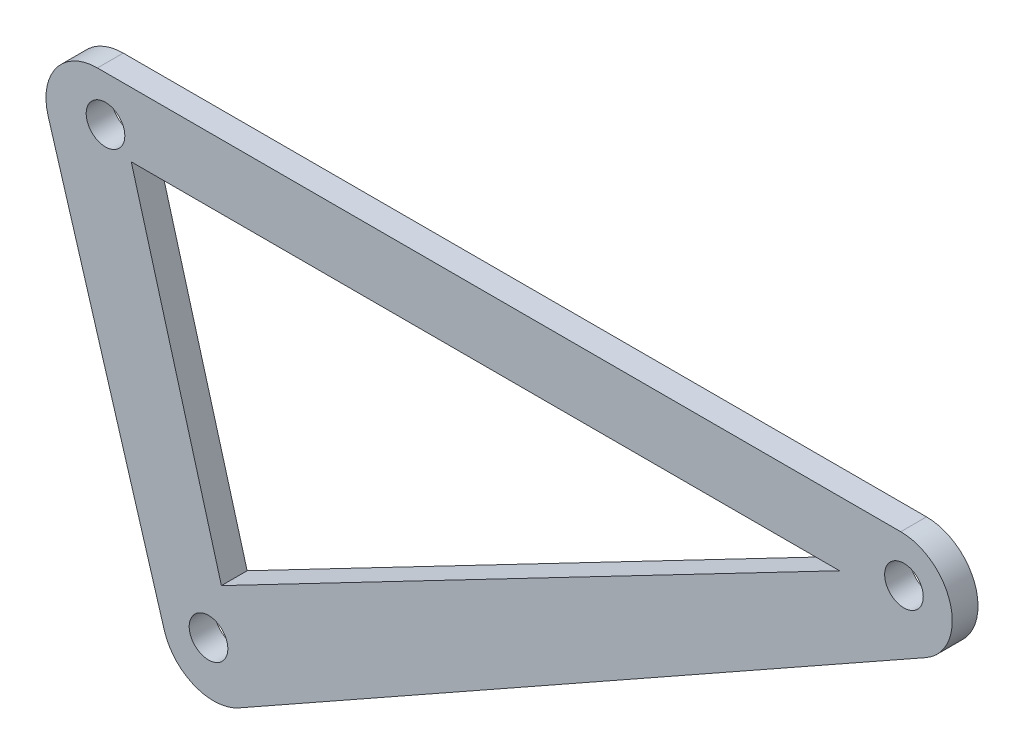
ISO-10303-21;
HEADER;
FILE_DESCRIPTION(('STEP AP214'),'2;1');
FILE_NAME('part.step','',(''),(''),'','','');
FILE_SCHEMA(('AUTOMOTIVE_DESIGN { 1 0 10303 214 1 1 1 1 }'));
ENDSEC;
DATA;
#1=APPLICATION_CONTEXT('core data for automotive mechanical design processes');
#2=APPLICATION_PROTOCOL_DEFINITION('international standard','automotive_design',2000,#1);
#3=PRODUCT_CONTEXT('',#1,'mechanical');
#4=PRODUCT('Part','Part','',(#3));
#5=PRODUCT_RELATED_PRODUCT_CATEGORY('part','',(#4));
#6=PRODUCT_DEFINITION_FORMATION('','',#4);
#7=PRODUCT_DEFINITION_CONTEXT('part definition',#1,'design');
#8=PRODUCT_DEFINITION('design','',#6,#7);
#9=PRODUCT_DEFINITION_SHAPE('','',#8);
#10=(LENGTH_UNIT() NAMED_UNIT(*) SI_UNIT(.MILLI.,.METRE.));
#11=(NAMED_UNIT(*) PLANE_ANGLE_UNIT() SI_UNIT($,.RADIAN.));
#12=(NAMED_UNIT(*) SI_UNIT($,.STERADIAN.) SOLID_ANGLE_UNIT());
#13=UNCERTAINTY_MEASURE_WITH_UNIT(LENGTH_MEASURE(1.E-05),#10,'distance_accuracy_value','');
#14=(GEOMETRIC_REPRESENTATION_CONTEXT(3) GLOBAL_UNCERTAINTY_ASSIGNED_CONTEXT((#13)) GLOBAL_UNIT_ASSIGNED_CONTEXT((#10,
#11,#12)) REPRESENTATION_CONTEXT('',''));
#15=CARTESIAN_POINT('',(0.,0.,0.));
#16=DIRECTION('',(0.,0.,1.));
#17=DIRECTION('',(1.,0.,0.));
#18=AXIS2_PLACEMENT_3D('',#15,#16,#17);
#19=CARTESIAN_POINT('',(-22.,11.5,0.));
#20=DIRECTION('',(0.,0.,-1.));
#21=DIRECTION('',(1.,0.,0.));
#22=AXIS2_PLACEMENT_3D('',#19,#20,#21);
#23=CYLINDRICAL_SURFACE('',#22,1.5);
#24=DIRECTION('',(0.,0.,1.));
#25=VECTOR('',#24,1.);
#26=CARTESIAN_POINT('',(-20.5,11.5,0.));
#27=LINE('',#26,#25);
#28=CARTESIAN_POINT('',(-20.5,11.5,0.));
#29=VERTEX_POINT('',#28);
#30=CARTESIAN_POINT('',(-20.5,11.5,2.));
#31=VERTEX_POINT('',#30);
#32=EDGE_CURVE('E9',#29,#31,#27,.T.);
#33=ORIENTED_EDGE('',*,*,#32,.T.);
#34=CARTESIAN_POINT('',(-22.,11.5,2.));
#35=DIRECTION('',(0.,0.,1.));
#36=DIRECTION('',(1.,0.,0.));
#37=AXIS2_PLACEMENT_3D('',#34,#35,#36);
#38=CIRCLE('',#37,1.5);
#39=EDGE_CURVE('E146',#31,#31,#38,.T.);
#40=ORIENTED_EDGE('',*,*,#39,.T.);
#41=ORIENTED_EDGE('',*,*,#32,.F.);
#42=CARTESIAN_POINT('',(-22.,11.5,0.));
#43=DIRECTION('',(0.,0.,1.));
#44=DIRECTION('',(1.,0.,0.));
#45=AXIS2_PLACEMENT_3D('',#42,#43,#44);
#46=CIRCLE('',#45,1.5);
#47=EDGE_CURVE('E185',#29,#29,#46,.T.);
#48=ORIENTED_EDGE('',*,*,#47,.F.);
#49=EDGE_LOOP('',(#33,#40,#41,#48));
#50=FACE_BOUND('',#49,.T.);
#51=ADVANCED_FACE('F14',(#50),#23,.F.);
#52=CARTESIAN_POINT('',(-14.,-19.,0.));
#53=DIRECTION('',(0.,0.,-1.));
#54=DIRECTION('',(1.,0.,0.));
#55=AXIS2_PLACEMENT_3D('',#52,#53,#54);
#56=CYLINDRICAL_SURFACE('',#55,1.5);
#57=DIRECTION('',(0.,0.,1.));
#58=VECTOR('',#57,1.);
#59=CARTESIAN_POINT('',(-12.5,-19.,0.));
#60=LINE('',#59,#58);
#61=CARTESIAN_POINT('',(-12.5,-19.,0.));
#62=VERTEX_POINT('',#61);
#63=CARTESIAN_POINT('',(-12.5,-19.,2.));
#64=VERTEX_POINT('',#63);
#65=EDGE_CURVE('E25',#62,#64,#60,.T.);
#66=ORIENTED_EDGE('',*,*,#65,.T.);
#67=CARTESIAN_POINT('',(-14.,-19.,2.));
#68=DIRECTION('',(0.,0.,1.));
#69=DIRECTION('',(1.,0.,0.));
#70=AXIS2_PLACEMENT_3D('',#67,#68,#69);
#71=CIRCLE('',#70,1.5);
#72=EDGE_CURVE('E201',#64,#64,#71,.T.);
#73=ORIENTED_EDGE('',*,*,#72,.T.);
#74=ORIENTED_EDGE('',*,*,#65,.F.);
#75=CARTESIAN_POINT('',(-14.,-19.,0.));
#76=DIRECTION('',(0.,0.,1.));
#77=DIRECTION('',(1.,0.,0.));
#78=AXIS2_PLACEMENT_3D('',#75,#76,#77);
#79=CIRCLE('',#78,1.5);
#80=EDGE_CURVE('E188',#62,#62,#79,.T.);
#81=ORIENTED_EDGE('',*,*,#80,.F.);
#82=EDGE_LOOP('',(#66,#73,#74,#81));
#83=FACE_BOUND('',#82,.T.);
#84=ADVANCED_FACE('F300',(#83),#56,.F.);
#85=CARTESIAN_POINT('',(40.,11.5,0.));
#86=DIRECTION('',(0.,0.,-1.));
#87=DIRECTION('',(1.,0.,0.));
#88=AXIS2_PLACEMENT_3D('',#85,#86,#87);
#89=CYLINDRICAL_SURFACE('',#88,1.5);
#90=DIRECTION('',(0.,0.,1.));
#91=VECTOR('',#90,1.);
#92=CARTESIAN_POINT('',(41.5,11.5,0.));
#93=LINE('',#92,#91);
#94=CARTESIAN_POINT('',(41.5,11.5,0.));
#95=VERTEX_POINT('',#94);
#96=CARTESIAN_POINT('',(41.5,11.5,2.));
#97=VERTEX_POINT('',#96);
#98=EDGE_CURVE('E197',#95,#97,#93,.T.);
#99=ORIENTED_EDGE('',*,*,#98,.T.);
#100=CARTESIAN_POINT('',(40.,11.5,2.));
#101=DIRECTION('',(0.,0.,1.));
#102=DIRECTION('',(1.,0.,0.));
#103=AXIS2_PLACEMENT_3D('',#100,#101,#102);
#104=CIRCLE('',#103,1.5);
#105=EDGE_CURVE('E208',#97,#97,#104,.T.);
#106=ORIENTED_EDGE('',*,*,#105,.T.);
#107=ORIENTED_EDGE('',*,*,#98,.F.);
#108=CARTESIAN_POINT('',(40.,11.5,0.));
#109=DIRECTION('',(0.,0.,1.));
#110=DIRECTION('',(1.,0.,0.));
#111=AXIS2_PLACEMENT_3D('',#108,#109,#110);
#112=CIRCLE('',#111,1.5);
#113=EDGE_CURVE('E177',#95,#95,#112,.T.);
#114=ORIENTED_EDGE('',*,*,#113,.F.);
#115=EDGE_LOOP('',(#99,#106,#107,#114));
#116=FACE_BOUND('',#115,.T.);
#117=ADVANCED_FACE('F304',(#116),#89,.F.);
#118=CARTESIAN_POINT('',(-20.,10.,0.));
#119=DIRECTION('',(0.962964019714161,0.269629925520045,0.));
#120=DIRECTION('',(0.,0.,-1.));
#121=AXIS2_PLACEMENT_3D('',#118,#119,#120);
#122=PLANE('',#121);
#123=DIRECTION('',(0.,0.,1.));
#124=VECTOR('',#123,1.);
#125=CARTESIAN_POINT('',(-20.,10.,0.));
#126=LINE('',#125,#124);
#127=CARTESIAN_POINT('',(-20.,10.,0.));
#128=VERTEX_POINT('',#127);
#129=CARTESIAN_POINT('',(-20.,10.,2.));
#130=VERTEX_POINT('',#129);
#131=EDGE_CURVE('E198',#128,#130,#126,.T.);
#132=ORIENTED_EDGE('',*,*,#131,.T.);
#133=DIRECTION('',(0.269629925520045,-0.962964019714161,0.));
#134=VECTOR('',#133,1.);
#135=CARTESIAN_POINT('',(-20.,10.,2.));
#136=LINE('',#135,#134);
#137=CARTESIAN_POINT('',(-13.,-15.,2.));
#138=VERTEX_POINT('',#137);
#139=EDGE_CURVE('E183',#130,#138,#136,.T.);
#140=ORIENTED_EDGE('',*,*,#139,.T.);
#141=DIRECTION('',(0.,0.,1.));
#142=VECTOR('',#141,1.);
#143=CARTESIAN_POINT('',(-13.,-15.,0.));
#144=LINE('',#143,#142);
#145=CARTESIAN_POINT('',(-13.,-15.,0.));
#146=VERTEX_POINT('',#145);
#147=EDGE_CURVE('E193',#146,#138,#144,.T.);
#148=ORIENTED_EDGE('',*,*,#147,.F.);
#149=DIRECTION('',(0.269629925520045,-0.962964019714161,0.));
#150=VECTOR('',#149,1.);
#151=CARTESIAN_POINT('',(-20.,10.,0.));
#152=LINE('',#151,#150);
#153=EDGE_CURVE('E234',#128,#146,#152,.T.);
#154=ORIENTED_EDGE('',*,*,#153,.F.);
#155=EDGE_LOOP('',(#132,#140,#148,#154));
#156=FACE_BOUND('',#155,.T.);
#157=ADVANCED_FACE('F16',(#156),#122,.T.);
#158=CARTESIAN_POINT('',(-13.,-15.,0.));
#159=DIRECTION('',(-0.461934418836985,0.886914084166971,0.));
#160=DIRECTION('',(0.,0.,1.));
#161=AXIS2_PLACEMENT_3D('',#158,#159,#160);
#162=PLANE('',#161);
#163=ORIENTED_EDGE('',*,*,#147,.T.);
#164=DIRECTION('',(0.886914084166971,0.461934418836985,0.));
#165=VECTOR('',#164,1.);
#166=CARTESIAN_POINT('',(-13.,-15.,2.));
#167=LINE('',#166,#165);
#168=CARTESIAN_POINT('',(35.,10.,2.));
#169=VERTEX_POINT('',#168);
#170=EDGE_CURVE('E179',#138,#169,#167,.T.);
#171=ORIENTED_EDGE('',*,*,#170,.T.);
#172=DIRECTION('',(0.,0.,1.));
#173=VECTOR('',#172,1.);
#174=CARTESIAN_POINT('',(35.,10.,0.));
#175=LINE('',#174,#173);
#176=CARTESIAN_POINT('',(35.,10.,0.));
#177=VERTEX_POINT('',#176);
#178=EDGE_CURVE('E212',#177,#169,#175,.T.);
#179=ORIENTED_EDGE('',*,*,#178,.F.);
#180=DIRECTION('',(0.886914084166971,0.461934418836985,0.));
#181=VECTOR('',#180,1.);
#182=CARTESIAN_POINT('',(-13.,-15.,0.));
#183=LINE('',#182,#181);
#184=EDGE_CURVE('E178',#146,#177,#183,.T.);
#185=ORIENTED_EDGE('',*,*,#184,.F.);
#186=EDGE_LOOP('',(#163,#171,#179,#185));
#187=FACE_BOUND('',#186,.T.);
#188=ADVANCED_FACE('F309',(#187),#162,.T.);
#189=CARTESIAN_POINT('',(-20.,10.,0.));
#190=DIRECTION('',(0.,1.,0.));
#191=DIRECTION('',(1.,0.,0.));
#192=AXIS2_PLACEMENT_3D('',#189,#190,#191);
#193=PLANE('',#192);
#194=DIRECTION('',(1.,0.,0.));
#195=VECTOR('',#194,1.);
#196=CARTESIAN_POINT('',(-20.,10.,0.));
#197=LINE('',#196,#195);
#198=EDGE_CURVE('E173',#128,#177,#197,.T.);
#199=ORIENTED_EDGE('',*,*,#198,.T.);
#200=ORIENTED_EDGE('',*,*,#178,.T.);
#201=DIRECTION('',(1.,0.,0.));
#202=VECTOR('',#201,1.);
#203=CARTESIAN_POINT('',(-20.,10.,2.));
#204=LINE('',#203,#202);
#205=EDGE_CURVE('E184',#130,#169,#204,.T.);
#206=ORIENTED_EDGE('',*,*,#205,.F.);
#207=ORIENTED_EDGE('',*,*,#131,.F.);
#208=EDGE_LOOP('',(#199,#200,#206,#207));
#209=FACE_BOUND('',#208,.T.);
#210=ADVANCED_FACE('F295',(#209),#193,.F.);
#211=CARTESIAN_POINT('',(-13.60585653325,-19.06006954394,0.));
#212=DIRECTION('',(0.,0.,1.));
#213=DIRECTION('',(-0.957826285221234,-0.28734788556607,0.));
#214=AXIS2_PLACEMENT_3D('',#211,#212,#213);
#215=CYLINDRICAL_SURFACE('',#214,4.);
#216=CARTESIAN_POINT('',(-13.60585653325,-19.06006954394,0.));
#217=DIRECTION('',(0.,0.,1.));
#218=DIRECTION('',(0.,-1.,0.));
#219=AXIS2_PLACEMENT_3D('',#216,#217,#218);
#220=CIRCLE('',#219,4.);
#221=CARTESIAN_POINT('',(-17.43716167413,-20.20946108621,0.));
#222=VERTEX_POINT('',#221);
#223=CARTESIAN_POINT('',(-11.64248159748,-22.54506005492,0.));
#224=VERTEX_POINT('',#223);
#225=EDGE_CURVE('E142',#222,#224,#220,.T.);
#226=ORIENTED_EDGE('',*,*,#225,.T.);
#227=DIRECTION('',(0.,0.,1.));
#228=VECTOR('',#227,1.);
#229=CARTESIAN_POINT('',(-11.64248159748,-22.54506005492,0.));
#230=LINE('',#229,#228);
#231=CARTESIAN_POINT('',(-11.64248159748,-22.54506005492,2.));
#232=VERTEX_POINT('',#231);
#233=EDGE_CURVE('E131',#224,#232,#230,.T.);
#234=ORIENTED_EDGE('',*,*,#233,.T.);
#235=CARTESIAN_POINT('',(-13.60585653325,-19.06006954394,2.));
#236=DIRECTION('',(0.,0.,1.));
#237=DIRECTION('',(0.,-1.,0.));
#238=AXIS2_PLACEMENT_3D('',#235,#236,#237);
#239=CIRCLE('',#238,4.);
#240=CARTESIAN_POINT('',(-17.43716167413,-20.20946108621,2.));
#241=VERTEX_POINT('',#240);
#242=EDGE_CURVE('E144',#241,#232,#239,.T.);
#243=ORIENTED_EDGE('',*,*,#242,.F.);
#244=DIRECTION('',(0.,0.,1.));
#245=VECTOR('',#244,1.);
#246=CARTESIAN_POINT('',(-17.43716167413,-20.20946108621,0.));
#247=LINE('',#246,#245);
#248=EDGE_CURVE('E138',#222,#241,#247,.T.);
#249=ORIENTED_EDGE('',*,*,#248,.F.);
#250=EDGE_LOOP('',(#226,#234,#243,#249));
#251=FACE_BOUND('',#250,.T.);
#252=ADVANCED_FACE('F140',(#251),#215,.T.);
#253=CARTESIAN_POINT('',(-16.,-25.,0.));
#254=DIRECTION('',(-0.490843733940894,0.871247627744811,0.));
#255=DIRECTION('',(0.,0.,1.));
#256=AXIS2_PLACEMENT_3D('',#253,#254,#255);
#257=PLANE('',#256);
#258=DIRECTION('',(0.,0.,1.));
#259=VECTOR('',#258,1.);
#260=CARTESIAN_POINT('',(41.714141843011,7.51500948902,0.));
#261=LINE('',#260,#259);
#262=CARTESIAN_POINT('',(41.714141843011,7.51500948902,0.));
#263=VERTEX_POINT('',#262);
#264=CARTESIAN_POINT('',(41.714141843011,7.51500948902,2.));
#265=VERTEX_POINT('',#264);
#266=EDGE_CURVE('E247',#263,#265,#261,.T.);
#267=ORIENTED_EDGE('',*,*,#266,.T.);
#268=DIRECTION('',(0.871247627744811,0.490843733940894,0.));
#269=VECTOR('',#268,1.);
#270=CARTESIAN_POINT('',(-16.,-25.,2.));
#271=LINE('',#270,#269);
#272=EDGE_CURVE('E111',#232,#265,#271,.T.);
#273=ORIENTED_EDGE('',*,*,#272,.F.);
#274=ORIENTED_EDGE('',*,*,#233,.F.);
#275=DIRECTION('',(0.871247627744811,0.490843733940894,0.));
#276=VECTOR('',#275,1.);
#277=CARTESIAN_POINT('',(-16.,-25.,0.));
#278=LINE('',#277,#276);
#279=EDGE_CURVE('E160',#224,#263,#278,.T.);
#280=ORIENTED_EDGE('',*,*,#279,.T.);
#281=EDGE_LOOP('',(#267,#273,#274,#280));
#282=FACE_BOUND('',#281,.T.);
#283=ADVANCED_FACE('F287',(#282),#257,.F.);
#284=CARTESIAN_POINT('',(-28.,15.,0.));
#285=DIRECTION('',(0.957826285221234,0.28734788556607,0.));
#286=DIRECTION('',(0.,0.,-1.));
#287=AXIS2_PLACEMENT_3D('',#284,#285,#286);
#288=PLANE('',#287);
#289=ORIENTED_EDGE('',*,*,#248,.T.);
#290=DIRECTION('',(0.28734788556607,-0.957826285221234,0.));
#291=VECTOR('',#290,1.);
#292=CARTESIAN_POINT('',(-28.,15.,2.));
#293=LINE('',#292,#291);
#294=CARTESIAN_POINT('',(-26.45518253732,9.850608457735,2.));
#295=VERTEX_POINT('',#294);
#296=EDGE_CURVE('E18',#295,#241,#293,.T.);
#297=ORIENTED_EDGE('',*,*,#296,.F.);
#298=DIRECTION('',(0.,0.,1.));
#299=VECTOR('',#298,1.);
#300=CARTESIAN_POINT('',(-26.45518253732,9.850608457735,0.));
#301=LINE('',#300,#299);
#302=CARTESIAN_POINT('',(-26.45518253732,9.850608457735,0.));
#303=VERTEX_POINT('',#302);
#304=EDGE_CURVE('E152',#303,#295,#301,.T.);
#305=ORIENTED_EDGE('',*,*,#304,.F.);
#306=DIRECTION('',(0.28734788556607,-0.957826285221234,0.));
#307=VECTOR('',#306,1.);
#308=CARTESIAN_POINT('',(-28.,15.,0.));
#309=LINE('',#308,#307);
#310=EDGE_CURVE('E149',#303,#222,#309,.T.);
#311=ORIENTED_EDGE('',*,*,#310,.T.);
#312=EDGE_LOOP('',(#289,#297,#305,#311));
#313=FACE_BOUND('',#312,.T.);
#314=ADVANCED_FACE('F150',(#313),#288,.F.);
#315=CARTESIAN_POINT('',(6.584506802705,2.768453416076,2.));
#316=DIRECTION('',(0.,0.,1.));
#317=DIRECTION('',(1.,0.,0.));
#318=AXIS2_PLACEMENT_3D('',#315,#316,#317);
#319=PLANE('',#318);
#320=ORIENTED_EDGE('',*,*,#39,.F.);
#321=EDGE_LOOP('',(#320));
#322=FACE_BOUND('',#321,.T.);
#323=ORIENTED_EDGE('',*,*,#72,.F.);
#324=EDGE_LOOP('',(#323));
#325=FACE_BOUND('',#324,.T.);
#326=ORIENTED_EDGE('',*,*,#105,.F.);
#327=EDGE_LOOP('',(#326));
#328=FACE_BOUND('',#327,.T.);
#329=ORIENTED_EDGE('',*,*,#205,.T.);
#330=ORIENTED_EDGE('',*,*,#170,.F.);
#331=ORIENTED_EDGE('',*,*,#139,.F.);
#332=EDGE_LOOP('',(#329,#330,#331));
#333=FACE_BOUND('',#332,.T.);
#334=DIRECTION('',(1.,0.,0.));
#335=VECTOR('',#334,1.);
#336=CARTESIAN_POINT('',(-28.,15.,2.));
#337=LINE('',#336,#335);
#338=CARTESIAN_POINT('',(-22.62387739643,15.,2.));
#339=VERTEX_POINT('',#338);
#340=CARTESIAN_POINT('',(39.750766907248,15.,2.));
#341=VERTEX_POINT('',#340);
#342=EDGE_CURVE('E232',#339,#341,#337,.T.);
#343=ORIENTED_EDGE('',*,*,#342,.F.);
#344=CARTESIAN_POINT('',(-22.62387739643,11.,2.));
#345=DIRECTION('',(0.,0.,1.));
#346=DIRECTION('',(0.,-1.,0.));
#347=AXIS2_PLACEMENT_3D('',#344,#345,#346);
#348=CIRCLE('',#347,4.);
#349=EDGE_CURVE('E192',#339,#295,#348,.T.);
#350=ORIENTED_EDGE('',*,*,#349,.T.);
#351=ORIENTED_EDGE('',*,*,#296,.T.);
#352=ORIENTED_EDGE('',*,*,#242,.T.);
#353=ORIENTED_EDGE('',*,*,#272,.T.);
#354=CARTESIAN_POINT('',(39.750766907248,11.,2.));
#355=DIRECTION('',(0.,0.,-1.));
#356=DIRECTION('',(0.,-1.,0.));
#357=AXIS2_PLACEMENT_3D('',#354,#355,#356);
#358=CIRCLE('',#357,4.);
#359=EDGE_CURVE('E243',#341,#265,#358,.T.);
#360=ORIENTED_EDGE('',*,*,#359,.F.);
#361=EDGE_LOOP('',(#343,#350,#351,#352,#353,#360));
#362=FACE_BOUND('',#361,.T.);
#363=ADVANCED_FACE('F283',(#322,#325,#328,#333,#362),#319,.T.);
#364=CARTESIAN_POINT('',(39.750766907248,11.,0.));
#365=DIRECTION('',(0.,0.,1.));
#366=DIRECTION('',(0.,1.,0.));
#367=AXIS2_PLACEMENT_3D('',#364,#365,#366);
#368=CYLINDRICAL_SURFACE('',#367,4.);
#369=DIRECTION('',(0.,0.,1.));
#370=VECTOR('',#369,1.);
#371=CARTESIAN_POINT('',(39.750766907248,15.,0.));
#372=LINE('',#371,#370);
#373=CARTESIAN_POINT('',(39.750766907248,15.,0.));
#374=VERTEX_POINT('',#373);
#375=EDGE_CURVE('E229',#374,#341,#372,.T.);
#376=ORIENTED_EDGE('',*,*,#375,.T.);
#377=ORIENTED_EDGE('',*,*,#359,.T.);
#378=ORIENTED_EDGE('',*,*,#266,.F.);
#379=CARTESIAN_POINT('',(39.750766907248,11.,0.));
#380=DIRECTION('',(0.,0.,-1.));
#381=DIRECTION('',(0.,-1.,0.));
#382=AXIS2_PLACEMENT_3D('',#379,#380,#381);
#383=CIRCLE('',#382,4.);
#384=EDGE_CURVE('E167',#374,#263,#383,.T.);
#385=ORIENTED_EDGE('',*,*,#384,.F.);
#386=EDGE_LOOP('',(#376,#377,#378,#385));
#387=FACE_BOUND('',#386,.T.);
#388=ADVANCED_FACE('F285',(#387),#368,.T.);
#389=CARTESIAN_POINT('',(-22.62387739643,11.,0.));
#390=DIRECTION('',(0.,0.,1.));
#391=DIRECTION('',(0.,1.,0.));
#392=AXIS2_PLACEMENT_3D('',#389,#390,#391);
#393=CYLINDRICAL_SURFACE('',#392,4.);
#394=CARTESIAN_POINT('',(-22.62387739643,11.,0.));
#395=DIRECTION('',(0.,0.,1.));
#396=DIRECTION('',(0.,-1.,0.));
#397=AXIS2_PLACEMENT_3D('',#394,#395,#396);
#398=CIRCLE('',#397,4.);
#399=CARTESIAN_POINT('',(-22.62387739643,15.,0.));
#400=VERTEX_POINT('',#399);
#401=EDGE_CURVE('E156',#400,#303,#398,.T.);
#402=ORIENTED_EDGE('',*,*,#401,.T.);
#403=ORIENTED_EDGE('',*,*,#304,.T.);
#404=ORIENTED_EDGE('',*,*,#349,.F.);
#405=DIRECTION('',(0.,0.,1.));
#406=VECTOR('',#405,1.);
#407=CARTESIAN_POINT('',(-22.62387739643,15.,0.));
#408=LINE('',#407,#406);
#409=EDGE_CURVE('E171',#400,#339,#408,.T.);
#410=ORIENTED_EDGE('',*,*,#409,.F.);
#411=EDGE_LOOP('',(#402,#403,#404,#410));
#412=FACE_BOUND('',#411,.T.);
#413=ADVANCED_FACE('F282',(#412),#393,.T.);
#414=CARTESIAN_POINT('',(6.584506802705,2.768453416076,0.));
#415=DIRECTION('',(0.,0.,1.));
#416=DIRECTION('',(1.,0.,0.));
#417=AXIS2_PLACEMENT_3D('',#414,#415,#416);
#418=PLANE('',#417);
#419=ORIENTED_EDGE('',*,*,#47,.T.);
#420=EDGE_LOOP('',(#419));
#421=FACE_BOUND('',#420,.T.);
#422=ORIENTED_EDGE('',*,*,#80,.T.);
#423=EDGE_LOOP('',(#422));
#424=FACE_BOUND('',#423,.T.);
#425=ORIENTED_EDGE('',*,*,#113,.T.);
#426=EDGE_LOOP('',(#425));
#427=FACE_BOUND('',#426,.T.);
#428=ORIENTED_EDGE('',*,*,#153,.T.);
#429=ORIENTED_EDGE('',*,*,#184,.T.);
#430=ORIENTED_EDGE('',*,*,#198,.F.);
#431=EDGE_LOOP('',(#428,#429,#430));
#432=FACE_BOUND('',#431,.T.);
#433=ORIENTED_EDGE('',*,*,#384,.T.);
#434=ORIENTED_EDGE('',*,*,#279,.F.);
#435=ORIENTED_EDGE('',*,*,#225,.F.);
#436=ORIENTED_EDGE('',*,*,#310,.F.);
#437=ORIENTED_EDGE('',*,*,#401,.F.);
#438=DIRECTION('',(1.,0.,0.));
#439=VECTOR('',#438,1.);
#440=CARTESIAN_POINT('',(-28.,15.,0.));
#441=LINE('',#440,#439);
#442=EDGE_CURVE('E266',#400,#374,#441,.T.);
#443=ORIENTED_EDGE('',*,*,#442,.T.);
#444=EDGE_LOOP('',(#433,#434,#435,#436,#437,#443));
#445=FACE_BOUND('',#444,.T.);
#446=ADVANCED_FACE('F159',(#421,#424,#427,#432,#445),#418,.F.);
#447=CARTESIAN_POINT('',(-28.,15.,0.));
#448=DIRECTION('',(0.,1.,0.));
#449=DIRECTION('',(1.,0.,0.));
#450=AXIS2_PLACEMENT_3D('',#447,#448,#449);
#451=PLANE('',#450);
#452=ORIENTED_EDGE('',*,*,#442,.F.);
#453=ORIENTED_EDGE('',*,*,#409,.T.);
#454=ORIENTED_EDGE('',*,*,#342,.T.);
#455=ORIENTED_EDGE('',*,*,#375,.F.);
#456=EDGE_LOOP('',(#452,#453,#454,#455));
#457=FACE_BOUND('',#456,.T.);
#458=ADVANCED_FACE('F278',(#457),#451,.T.);
#459=CLOSED_SHELL('',(#51,#84,#117,#157,#188,#210,#252,#283,#314,#363,#388,#413,#446,#458));
#460=MANIFOLD_SOLID_BREP('B1',#459);
#461=ADVANCED_BREP_SHAPE_REPRESENTATION('',(#18,#460),#14);
#462=SHAPE_DEFINITION_REPRESENTATION(#9,#461);
ENDSEC;
END-ISO-10303-21;
